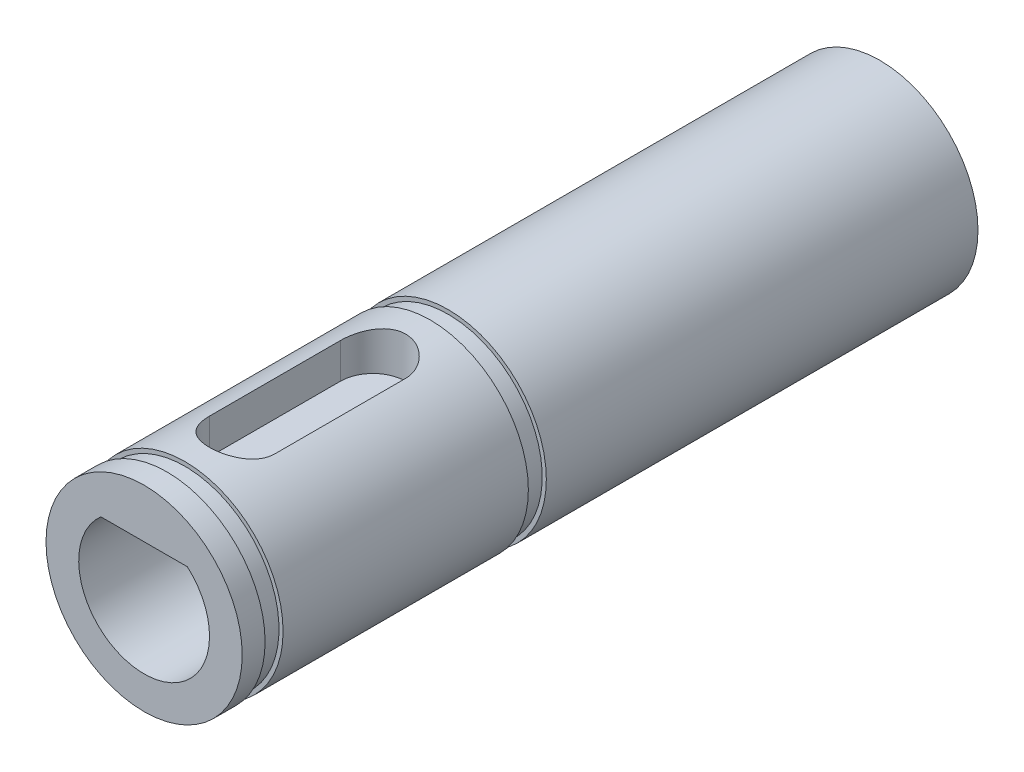
ISO-10303-21;
HEADER;
FILE_DESCRIPTION(('STEP AP214'),'2;1');
FILE_NAME('part.step','',(''),(''),'','','');
FILE_SCHEMA(('AUTOMOTIVE_DESIGN { 1 0 10303 214 1 1 1 1 }'));
ENDSEC;
DATA;
#1=APPLICATION_CONTEXT('core data for automotive mechanical design processes');
#2=APPLICATION_PROTOCOL_DEFINITION('international standard','automotive_design',2000,#1);
#3=PRODUCT_CONTEXT('',#1,'mechanical');
#4=PRODUCT('Part','Part','',(#3));
#5=PRODUCT_RELATED_PRODUCT_CATEGORY('part','',(#4));
#6=PRODUCT_DEFINITION_FORMATION('','',#4);
#7=PRODUCT_DEFINITION_CONTEXT('part definition',#1,'design');
#8=PRODUCT_DEFINITION('design','',#6,#7);
#9=PRODUCT_DEFINITION_SHAPE('','',#8);
#10=(LENGTH_UNIT() NAMED_UNIT(*) SI_UNIT(.MILLI.,.METRE.));
#11=(NAMED_UNIT(*) PLANE_ANGLE_UNIT() SI_UNIT($,.RADIAN.));
#12=(NAMED_UNIT(*) SI_UNIT($,.STERADIAN.) SOLID_ANGLE_UNIT());
#13=UNCERTAINTY_MEASURE_WITH_UNIT(LENGTH_MEASURE(1.E-05),#10,'distance_accuracy_value','');
#14=(GEOMETRIC_REPRESENTATION_CONTEXT(3) GLOBAL_UNCERTAINTY_ASSIGNED_CONTEXT((#13)) GLOBAL_UNIT_ASSIGNED_CONTEXT((#10,
#11,#12)) REPRESENTATION_CONTEXT('',''));
#15=CARTESIAN_POINT('',(0.,0.,0.));
#16=DIRECTION('',(0.,0.,1.));
#17=DIRECTION('',(1.,0.,0.));
#18=AXIS2_PLACEMENT_3D('',#15,#16,#17);
#19=CARTESIAN_POINT('',(0.,0.,45.));
#20=DIRECTION('',(0.,0.,-1.));
#21=DIRECTION('',(-1.,0.,0.));
#22=AXIS2_PLACEMENT_3D('',#19,#20,#21);
#23=CYLINDRICAL_SURFACE('',#22,6.);
#24=CARTESIAN_POINT('',(0.,0.,43.6));
#25=DIRECTION('',(0.,0.,-1.));
#26=DIRECTION('',(-1.,0.,0.));
#27=AXIS2_PLACEMENT_3D('',#24,#25,#26);
#28=CIRCLE('',#27,6.);
#29=CARTESIAN_POINT('',(-6.,0.,43.6));
#30=VERTEX_POINT('',#29);
#31=EDGE_CURVE('E219',#30,#30,#28,.T.);
#32=CARTESIAN_POINT('',(0.,0.,45.));
#33=DIRECTION('',(0.,0.,1.));
#34=DIRECTION('',(1.,0.,0.));
#35=AXIS2_PLACEMENT_3D('',#32,#33,#34);
#36=CIRCLE('',#35,6.);
#37=CARTESIAN_POINT('',(-6.,0.,45.));
#38=VERTEX_POINT('',#37);
#39=EDGE_CURVE('E146',#38,#38,#36,.T.);
#40=CARTESIAN_POINT('',(-6.,0.,43.6));
#41=CARTESIAN_POINT('',(-6.,0.,43.6145833333333));
#42=CARTESIAN_POINT('',(-6.,0.,43.6291666666667));
#43=CARTESIAN_POINT('',(-6.,0.,43.6583333333333));
#44=CARTESIAN_POINT('',(-6.,0.,43.6729166666667));
#45=CARTESIAN_POINT('',(-6.,0.,43.7020833333333));
#46=CARTESIAN_POINT('',(-6.,0.,43.7166666666667));
#47=CARTESIAN_POINT('',(-6.,0.,43.7458333333333));
#48=CARTESIAN_POINT('',(-6.,0.,43.7604166666667));
#49=CARTESIAN_POINT('',(-6.,0.,43.7895833333333));
#50=CARTESIAN_POINT('',(-6.,0.,43.8041666666667));
#51=CARTESIAN_POINT('',(-6.,0.,43.8333333333333));
#52=CARTESIAN_POINT('',(-6.,0.,43.8479166666667));
#53=CARTESIAN_POINT('',(-6.,0.,43.8770833333333));
#54=CARTESIAN_POINT('',(-6.,0.,43.8916666666667));
#55=CARTESIAN_POINT('',(-6.,0.,43.9208333333333));
#56=CARTESIAN_POINT('',(-6.,0.,43.9354166666667));
#57=CARTESIAN_POINT('',(-6.,0.,43.9645833333333));
#58=CARTESIAN_POINT('',(-6.,0.,43.9791666666667));
#59=CARTESIAN_POINT('',(-6.,0.,44.0083333333333));
#60=CARTESIAN_POINT('',(-6.,0.,44.0229166666667));
#61=CARTESIAN_POINT('',(-6.,0.,44.0520833333333));
#62=CARTESIAN_POINT('',(-6.,0.,44.0666666666667));
#63=CARTESIAN_POINT('',(-6.,0.,44.0958333333333));
#64=CARTESIAN_POINT('',(-6.,0.,44.1104166666667));
#65=CARTESIAN_POINT('',(-6.,0.,44.1395833333333));
#66=CARTESIAN_POINT('',(-6.,0.,44.1541666666667));
#67=CARTESIAN_POINT('',(-6.,0.,44.1833333333333));
#68=CARTESIAN_POINT('',(-6.,0.,44.1979166666667));
#69=CARTESIAN_POINT('',(-6.,0.,44.2270833333333));
#70=CARTESIAN_POINT('',(-6.,0.,44.2416666666667));
#71=CARTESIAN_POINT('',(-6.,0.,44.2708333333333));
#72=CARTESIAN_POINT('',(-6.,0.,44.2854166666667));
#73=CARTESIAN_POINT('',(-6.,0.,44.3145833333333));
#74=CARTESIAN_POINT('',(-6.,0.,44.3291666666667));
#75=CARTESIAN_POINT('',(-6.,0.,44.3583333333333));
#76=CARTESIAN_POINT('',(-6.,0.,44.3729166666667));
#77=CARTESIAN_POINT('',(-6.,0.,44.4020833333333));
#78=CARTESIAN_POINT('',(-6.,0.,44.4166666666667));
#79=CARTESIAN_POINT('',(-6.,0.,44.4458333333333));
#80=CARTESIAN_POINT('',(-6.,0.,44.4604166666667));
#81=CARTESIAN_POINT('',(-6.,0.,44.4895833333333));
#82=CARTESIAN_POINT('',(-6.,0.,44.5041666666667));
#83=CARTESIAN_POINT('',(-6.,0.,44.5333333333333));
#84=CARTESIAN_POINT('',(-6.,0.,44.5479166666667));
#85=CARTESIAN_POINT('',(-6.,0.,44.5770833333333));
#86=CARTESIAN_POINT('',(-6.,0.,44.5916666666667));
#87=CARTESIAN_POINT('',(-6.,0.,44.6208333333333));
#88=CARTESIAN_POINT('',(-6.,0.,44.6354166666667));
#89=CARTESIAN_POINT('',(-6.,0.,44.6645833333333));
#90=CARTESIAN_POINT('',(-6.,0.,44.6791666666667));
#91=CARTESIAN_POINT('',(-6.,0.,44.7083333333333));
#92=CARTESIAN_POINT('',(-6.,0.,44.7229166666667));
#93=CARTESIAN_POINT('',(-6.,0.,44.7520833333333));
#94=CARTESIAN_POINT('',(-6.,0.,44.7666666666667));
#95=CARTESIAN_POINT('',(-6.,0.,44.7958333333333));
#96=CARTESIAN_POINT('',(-6.,0.,44.8104166666667));
#97=CARTESIAN_POINT('',(-6.,0.,44.8395833333333));
#98=CARTESIAN_POINT('',(-6.,0.,44.8541666666667));
#99=CARTESIAN_POINT('',(-6.,0.,44.8833333333333));
#100=CARTESIAN_POINT('',(-6.,0.,44.8979166666667));
#101=CARTESIAN_POINT('',(-6.,0.,44.9270833333333));
#102=CARTESIAN_POINT('',(-6.,0.,44.9416666666667));
#103=CARTESIAN_POINT('',(-6.,0.,44.9708333333333));
#104=CARTESIAN_POINT('',(-6.,0.,44.9854166666667));
#105=CARTESIAN_POINT('',(-6.,0.,45.));
#106=B_SPLINE_CURVE_WITH_KNOTS('',3,(#40,#41,#42,#43,#44,#45,#46,#47,#48,#49,#50,#51,#52,#53,
#54,#55,#56,#57,#58,#59,#60,#61,#62,#63,#64,#65,#66,#67,#68,#69,#70,#71,#72,#73,#74,#75,#76,#77,
#78,#79,#80,#81,#82,#83,#84,#85,#86,#87,#88,#89,#90,#91,#92,#93,#94,#95,#96,#97,#98,#99,#100,
#101,#102,#103,#104,#105),.UNSPECIFIED.,.F.,.F.,(4,2,2,2,2,2,2,2,2,2,2,2,2,2,2,2,2,2,2,2,2,2,2,
2,2,2,2,2,2,2,2,2,4),(0.,0.0437499999999952,0.0874999999999973,0.131249999999992,
0.174999999999995,0.218749999999997,0.262499999999992,0.306249999999994,0.349999999999996,
0.393749999999991,0.437499999999993,0.481249999999996,0.524999999999991,0.568749999999993,
0.612499999999995,0.65624999999999,0.699999999999992,0.743749999999994,0.78749999999999,
0.831249999999992,0.874999999999994,0.918749999999989,0.962499999999991,1.00624999999999,
1.04999999999999,1.09374999999999,1.13749999999999,1.18124999999999,1.22499999999999,
1.26874999999999,1.31249999999999,1.35624999999999,1.39999999999999),.UNSPECIFIED.);
#107=EDGE_CURVE('BSEAM39',#30,#38,#106,.T.);
#108=ORIENTED_EDGE('',*,*,#31,.F.);
#109=ORIENTED_EDGE('',*,*,#39,.F.);
#110=ORIENTED_EDGE('',*,*,#107,.T.);
#111=ORIENTED_EDGE('',*,*,#107,.F.);
#112=EDGE_LOOP('',(#108,#110,#109,#111));
#113=FACE_BOUND('',#112,.T.);
#114=ADVANCED_FACE('F39',(#113),#23,.T.);
#115=CARTESIAN_POINT('',(0.,0.,45.));
#116=DIRECTION('',(0.,0.,1.));
#117=DIRECTION('',(1.,0.,0.));
#118=AXIS2_PLACEMENT_3D('',#115,#116,#117);
#119=PLANE('',#118);
#120=ORIENTED_EDGE('',*,*,#39,.T.);
#121=EDGE_LOOP('',(#120));
#122=FACE_BOUND('',#121,.T.);
#123=DIRECTION('',(-1.,0.,0.));
#124=VECTOR('',#123,1.);
#125=CARTESIAN_POINT('',(-2.64575131106459,3.,45.));
#126=LINE('',#125,#124);
#127=CARTESIAN_POINT('',(2.64575131106459,3.,45.));
#128=VERTEX_POINT('',#127);
#129=CARTESIAN_POINT('',(-2.64575131106459,3.,45.));
#130=VERTEX_POINT('',#129);
#131=EDGE_CURVE('E134',#128,#130,#126,.T.);
#132=ORIENTED_EDGE('',*,*,#131,.F.);
#133=CARTESIAN_POINT('',(0.,0.,45.));
#134=DIRECTION('',(0.,0.,1.));
#135=DIRECTION('',(1.,0.,0.));
#136=AXIS2_PLACEMENT_3D('',#133,#134,#135);
#137=CIRCLE('',#136,4.);
#138=EDGE_CURVE('E132',#130,#128,#137,.T.);
#139=ORIENTED_EDGE('',*,*,#138,.F.);
#140=EDGE_LOOP('',(#132,#139));
#141=FACE_BOUND('',#140,.T.);
#142=ADVANCED_FACE('F184',(#122,#141),#119,.T.);
#143=CARTESIAN_POINT('',(0.,0.,0.));
#144=DIRECTION('',(0.,0.,1.));
#145=DIRECTION('',(1.,0.,0.));
#146=AXIS2_PLACEMENT_3D('',#143,#144,#145);
#147=PLANE('',#146);
#148=CARTESIAN_POINT('',(0.,0.,0.));
#149=DIRECTION('',(0.,0.,1.));
#150=DIRECTION('',(1.,0.,0.));
#151=AXIS2_PLACEMENT_3D('',#148,#149,#150);
#152=CIRCLE('',#151,6.);
#153=CARTESIAN_POINT('',(-6.,0.,0.));
#154=VERTEX_POINT('',#153);
#155=EDGE_CURVE('E145',#154,#154,#152,.T.);
#156=ORIENTED_EDGE('',*,*,#155,.F.);
#157=EDGE_LOOP('',(#156));
#158=FACE_BOUND('',#157,.T.);
#159=CARTESIAN_POINT('',(0.,0.,0.));
#160=DIRECTION('',(0.,0.,1.));
#161=DIRECTION('',(1.,0.,0.));
#162=AXIS2_PLACEMENT_3D('',#159,#160,#161);
#163=CIRCLE('',#162,4.);
#164=CARTESIAN_POINT('',(-2.64575131106459,3.,0.));
#165=VERTEX_POINT('',#164);
#166=CARTESIAN_POINT('',(2.64575131106459,3.,0.));
#167=VERTEX_POINT('',#166);
#168=EDGE_CURVE('E127',#165,#167,#163,.T.);
#169=ORIENTED_EDGE('',*,*,#168,.T.);
#170=DIRECTION('',(-1.,0.,0.));
#171=VECTOR('',#170,1.);
#172=CARTESIAN_POINT('',(-2.64575131106459,3.,0.));
#173=LINE('',#172,#171);
#174=EDGE_CURVE('E135',#167,#165,#173,.T.);
#175=ORIENTED_EDGE('',*,*,#174,.T.);
#176=EDGE_LOOP('',(#169,#175));
#177=FACE_BOUND('',#176,.T.);
#178=ADVANCED_FACE('F186',(#158,#177),#147,.F.);
#179=CARTESIAN_POINT('',(0.,0.,26.4));
#180=DIRECTION('',(0.,0.,-1.));
#181=DIRECTION('',(-1.,0.,0.));
#182=AXIS2_PLACEMENT_3D('',#179,#180,#181);
#183=CIRCLE('',#182,6.);
#184=CARTESIAN_POINT('',(-6.,0.,26.4));
#185=VERTEX_POINT('',#184);
#186=EDGE_CURVE('E227',#185,#185,#183,.T.);
#187=CARTESIAN_POINT('',(-6.,0.,26.4));
#188=CARTESIAN_POINT('',(-6.,0.,26.125));
#189=CARTESIAN_POINT('',(-6.,0.,25.85));
#190=CARTESIAN_POINT('',(-6.,0.,25.3));
#191=CARTESIAN_POINT('',(-6.,0.,25.025));
#192=CARTESIAN_POINT('',(-6.,0.,24.475));
#193=CARTESIAN_POINT('',(-6.,0.,24.2));
#194=CARTESIAN_POINT('',(-6.,0.,23.65));
#195=CARTESIAN_POINT('',(-6.,0.,23.375));
#196=CARTESIAN_POINT('',(-6.,0.,22.825));
#197=CARTESIAN_POINT('',(-6.,0.,22.55));
#198=CARTESIAN_POINT('',(-6.,0.,22.));
#199=CARTESIAN_POINT('',(-6.,0.,21.725));
#200=CARTESIAN_POINT('',(-6.,0.,21.175));
#201=CARTESIAN_POINT('',(-6.,0.,20.9));
#202=CARTESIAN_POINT('',(-6.,0.,20.35));
#203=CARTESIAN_POINT('',(-6.,0.,20.075));
#204=CARTESIAN_POINT('',(-6.,0.,19.525));
#205=CARTESIAN_POINT('',(-6.,0.,19.25));
#206=CARTESIAN_POINT('',(-6.,0.,18.7));
#207=CARTESIAN_POINT('',(-6.,0.,18.425));
#208=CARTESIAN_POINT('',(-6.,0.,17.875));
#209=CARTESIAN_POINT('',(-6.,0.,17.6));
#210=CARTESIAN_POINT('',(-6.,0.,17.05));
#211=CARTESIAN_POINT('',(-6.,0.,16.775));
#212=CARTESIAN_POINT('',(-6.,0.,16.225));
#213=CARTESIAN_POINT('',(-6.,0.,15.95));
#214=CARTESIAN_POINT('',(-6.,0.,15.4));
#215=CARTESIAN_POINT('',(-6.,0.,15.125));
#216=CARTESIAN_POINT('',(-6.,0.,14.575));
#217=CARTESIAN_POINT('',(-6.,0.,14.3));
#218=CARTESIAN_POINT('',(-6.,0.,13.75));
#219=CARTESIAN_POINT('',(-6.,0.,13.475));
#220=CARTESIAN_POINT('',(-6.,0.,12.925));
#221=CARTESIAN_POINT('',(-6.,0.,12.65));
#222=CARTESIAN_POINT('',(-6.,0.,12.1));
#223=CARTESIAN_POINT('',(-6.,0.,11.825));
#224=CARTESIAN_POINT('',(-6.,0.,11.275));
#225=CARTESIAN_POINT('',(-6.,0.,11.));
#226=CARTESIAN_POINT('',(-6.,0.,10.45));
#227=CARTESIAN_POINT('',(-6.,0.,10.175));
#228=CARTESIAN_POINT('',(-6.,0.,9.625));
#229=CARTESIAN_POINT('',(-6.,0.,9.35));
#230=CARTESIAN_POINT('',(-6.,0.,8.8));
#231=CARTESIAN_POINT('',(-6.,0.,8.525));
#232=CARTESIAN_POINT('',(-6.,0.,7.975));
#233=CARTESIAN_POINT('',(-6.,0.,7.7));
#234=CARTESIAN_POINT('',(-6.,0.,7.14999999999999));
#235=CARTESIAN_POINT('',(-6.,0.,6.87499999999999));
#236=CARTESIAN_POINT('',(-6.,0.,6.32499999999999));
#237=CARTESIAN_POINT('',(-6.,0.,6.05));
#238=CARTESIAN_POINT('',(-6.,0.,5.5));
#239=CARTESIAN_POINT('',(-6.,0.,5.225));
#240=CARTESIAN_POINT('',(-6.,0.,4.675));
#241=CARTESIAN_POINT('',(-6.,0.,4.4));
#242=CARTESIAN_POINT('',(-6.,0.,3.84999999999999));
#243=CARTESIAN_POINT('',(-6.,0.,3.57499999999999));
#244=CARTESIAN_POINT('',(-6.,0.,3.02499999999999));
#245=CARTESIAN_POINT('',(-6.,0.,2.75));
#246=CARTESIAN_POINT('',(-6.,0.,2.2));
#247=CARTESIAN_POINT('',(-6.,0.,1.92499999999999));
#248=CARTESIAN_POINT('',(-6.,0.,1.37499999999999));
#249=CARTESIAN_POINT('',(-6.,0.,1.09999999999999));
#250=CARTESIAN_POINT('',(-6.,0.,0.549999999999993));
#251=CARTESIAN_POINT('',(-6.,0.,0.274999999999993));
#252=CARTESIAN_POINT('',(-6.,0.,0.));
#253=B_SPLINE_CURVE_WITH_KNOTS('',3,(#187,#188,#189,#190,#191,#192,#193,#194,#195,#196,#197,
#198,#199,#200,#201,#202,#203,#204,#205,#206,#207,#208,#209,#210,#211,#212,#213,#214,#215,#216,
#217,#218,#219,#220,#221,#222,#223,#224,#225,#226,#227,#228,#229,#230,#231,#232,#233,#234,#235,
#236,#237,#238,#239,#240,#241,#242,#243,#244,#245,#246,#247,#248,#249,#250,#251,#252),
.UNSPECIFIED.,.F.,.F.,(4,2,2,2,2,2,2,2,2,2,2,2,2,2,2,2,2,2,2,2,2,2,2,2,2,2,2,2,2,2,2,2,4),(0.,
0.824999999999999,1.65,2.475,3.3,4.125,4.95,5.775,6.6,7.425,8.25,9.07500000000001,
9.90000000000001,10.725,11.55,12.375,13.2,14.025,14.85,15.675,16.5,17.325,18.15,18.975,19.8,
20.625,21.45,22.275,23.1,23.925,24.75,25.575,26.4),.UNSPECIFIED.);
#254=EDGE_CURVE('BSEAM41',#185,#154,#253,.T.);
#255=ORIENTED_EDGE('',*,*,#186,.T.);
#256=ORIENTED_EDGE('',*,*,#155,.T.);
#257=ORIENTED_EDGE('',*,*,#254,.T.);
#258=ORIENTED_EDGE('',*,*,#254,.F.);
#259=EDGE_LOOP('',(#255,#257,#256,#258));
#260=FACE_BOUND('',#259,.T.);
#261=ADVANCED_FACE('F41',(#260),#23,.T.);
#262=CARTESIAN_POINT('',(0.,0.,45.));
#263=DIRECTION('',(0.,0.,-1.));
#264=DIRECTION('',(-1.,0.,0.));
#265=AXIS2_PLACEMENT_3D('',#262,#263,#264);
#266=CYLINDRICAL_SURFACE('',#265,4.);
#267=ORIENTED_EDGE('',*,*,#168,.F.);
#268=DIRECTION('',(0.,0.,-1.));
#269=VECTOR('',#268,1.);
#270=CARTESIAN_POINT('',(-2.64575131106459,3.,45.));
#271=LINE('',#270,#269);
#272=EDGE_CURVE('E137',#130,#165,#271,.T.);
#273=ORIENTED_EDGE('',*,*,#272,.F.);
#274=ORIENTED_EDGE('',*,*,#138,.T.);
#275=DIRECTION('',(0.,0.,-1.));
#276=VECTOR('',#275,1.);
#277=CARTESIAN_POINT('',(2.64575131106459,3.,45.));
#278=LINE('',#277,#276);
#279=EDGE_CURVE('E63',#128,#167,#278,.T.);
#280=ORIENTED_EDGE('',*,*,#279,.T.);
#281=EDGE_LOOP('',(#267,#273,#274,#280));
#282=FACE_BOUND('',#281,.T.);
#283=ADVANCED_FACE('F180',(#282),#266,.F.);
#284=CARTESIAN_POINT('',(-2.64575131106459,3.,45.));
#285=DIRECTION('',(0.,-1.,0.));
#286=DIRECTION('',(0.,0.,-1.));
#287=AXIS2_PLACEMENT_3D('',#284,#285,#286);
#288=PLANE('',#287);
#289=ORIENTED_EDGE('',*,*,#174,.F.);
#290=ORIENTED_EDGE('',*,*,#279,.F.);
#291=ORIENTED_EDGE('',*,*,#131,.T.);
#292=ORIENTED_EDGE('',*,*,#272,.T.);
#293=EDGE_LOOP('',(#289,#290,#291,#292));
#294=FACE_BOUND('',#293,.T.);
#295=ADVANCED_FACE('F176',(#294),#288,.T.);
#296=CARTESIAN_POINT('',(0.,6.,43.6));
#297=DIRECTION('',(0.,0.,1.));
#298=DIRECTION('',(1.,0.,0.));
#299=AXIS2_PLACEMENT_3D('',#296,#297,#298);
#300=PLANE('',#299);
#301=CARTESIAN_POINT('',(0.,0.,43.6));
#302=DIRECTION('',(0.,0.,-1.));
#303=DIRECTION('',(-1.,0.,0.));
#304=AXIS2_PLACEMENT_3D('',#301,#302,#303);
#305=CIRCLE('',#304,5.75);
#306=CARTESIAN_POINT('',(-5.75,0.,43.6));
#307=VERTEX_POINT('',#306);
#308=EDGE_CURVE('E120',#307,#307,#305,.T.);
#309=ORIENTED_EDGE('',*,*,#308,.F.);
#310=EDGE_LOOP('',(#309));
#311=FACE_BOUND('',#310,.T.);
#312=ORIENTED_EDGE('',*,*,#31,.T.);
#313=EDGE_LOOP('',(#312));
#314=FACE_BOUND('',#313,.T.);
#315=ADVANCED_FACE('F179',(#311,#314),#300,.F.);
#316=CARTESIAN_POINT('',(0.,0.,0.));
#317=DIRECTION('',(0.,0.,-1.));
#318=DIRECTION('',(-1.,0.,0.));
#319=AXIS2_PLACEMENT_3D('',#316,#317,#318);
#320=CYLINDRICAL_SURFACE('',#319,5.75);
#321=CARTESIAN_POINT('',(0.,0.,42.5));
#322=DIRECTION('',(0.,0.,-1.));
#323=DIRECTION('',(-1.,0.,0.));
#324=AXIS2_PLACEMENT_3D('',#321,#322,#323);
#325=CIRCLE('',#324,5.75);
#326=CARTESIAN_POINT('',(-5.75,0.,42.5));
#327=VERTEX_POINT('',#326);
#328=EDGE_CURVE('E218',#327,#327,#325,.T.);
#329=ORIENTED_EDGE('',*,*,#328,.F.);
#330=EDGE_LOOP('',(#329));
#331=FACE_BOUND('',#330,.T.);
#332=ORIENTED_EDGE('',*,*,#308,.T.);
#333=EDGE_LOOP('',(#332));
#334=FACE_BOUND('',#333,.T.);
#335=ADVANCED_FACE('F234',(#331,#334),#320,.T.);
#336=CARTESIAN_POINT('',(0.,6.,42.5));
#337=DIRECTION('',(0.,0.,-1.));
#338=DIRECTION('',(-1.,0.,0.));
#339=AXIS2_PLACEMENT_3D('',#336,#337,#338);
#340=PLANE('',#339);
#341=CARTESIAN_POINT('',(0.,0.,42.5));
#342=DIRECTION('',(0.,0.,-1.));
#343=DIRECTION('',(-1.,0.,0.));
#344=AXIS2_PLACEMENT_3D('',#341,#342,#343);
#345=CIRCLE('',#344,6.);
#346=CARTESIAN_POINT('',(-6.,0.,42.5));
#347=VERTEX_POINT('',#346);
#348=EDGE_CURVE('E216',#347,#347,#345,.T.);
#349=ORIENTED_EDGE('',*,*,#348,.F.);
#350=EDGE_LOOP('',(#349));
#351=FACE_BOUND('',#350,.T.);
#352=ORIENTED_EDGE('',*,*,#328,.T.);
#353=EDGE_LOOP('',(#352));
#354=FACE_BOUND('',#353,.T.);
#355=ADVANCED_FACE('F242',(#351,#354),#340,.F.);
#356=CARTESIAN_POINT('',(0.,6.,27.5));
#357=DIRECTION('',(0.,0.,1.));
#358=DIRECTION('',(1.,0.,0.));
#359=AXIS2_PLACEMENT_3D('',#356,#357,#358);
#360=PLANE('',#359);
#361=CARTESIAN_POINT('',(0.,0.,27.5));
#362=DIRECTION('',(0.,0.,-1.));
#363=DIRECTION('',(-1.,0.,0.));
#364=AXIS2_PLACEMENT_3D('',#361,#362,#363);
#365=CIRCLE('',#364,5.75);
#366=CARTESIAN_POINT('',(-5.75,0.,27.5));
#367=VERTEX_POINT('',#366);
#368=EDGE_CURVE('E114',#367,#367,#365,.T.);
#369=ORIENTED_EDGE('',*,*,#368,.F.);
#370=EDGE_LOOP('',(#369));
#371=FACE_BOUND('',#370,.T.);
#372=CARTESIAN_POINT('',(0.,0.,27.5));
#373=DIRECTION('',(0.,0.,-1.));
#374=DIRECTION('',(-1.,0.,0.));
#375=AXIS2_PLACEMENT_3D('',#372,#373,#374);
#376=CIRCLE('',#375,6.);
#377=CARTESIAN_POINT('',(-6.,0.,27.5));
#378=VERTEX_POINT('',#377);
#379=EDGE_CURVE('E212',#378,#378,#376,.T.);
#380=ORIENTED_EDGE('',*,*,#379,.T.);
#381=EDGE_LOOP('',(#380));
#382=FACE_BOUND('',#381,.T.);
#383=ADVANCED_FACE('F257',(#371,#382),#360,.F.);
#384=CARTESIAN_POINT('',(0.,0.,0.));
#385=DIRECTION('',(0.,0.,-1.));
#386=DIRECTION('',(-1.,0.,0.));
#387=AXIS2_PLACEMENT_3D('',#384,#385,#386);
#388=CYLINDRICAL_SURFACE('',#387,5.75);
#389=CARTESIAN_POINT('',(0.,0.,26.4));
#390=DIRECTION('',(0.,0.,-1.));
#391=DIRECTION('',(-1.,0.,0.));
#392=AXIS2_PLACEMENT_3D('',#389,#390,#391);
#393=CIRCLE('',#392,5.75);
#394=CARTESIAN_POINT('',(-5.75,0.,26.4));
#395=VERTEX_POINT('',#394);
#396=EDGE_CURVE('E117',#395,#395,#393,.T.);
#397=ORIENTED_EDGE('',*,*,#396,.F.);
#398=EDGE_LOOP('',(#397));
#399=FACE_BOUND('',#398,.T.);
#400=ORIENTED_EDGE('',*,*,#368,.T.);
#401=EDGE_LOOP('',(#400));
#402=FACE_BOUND('',#401,.T.);
#403=ADVANCED_FACE('F251',(#399,#402),#388,.T.);
#404=CARTESIAN_POINT('',(0.,6.,26.4));
#405=DIRECTION('',(0.,0.,-1.));
#406=DIRECTION('',(-1.,0.,0.));
#407=AXIS2_PLACEMENT_3D('',#404,#405,#406);
#408=PLANE('',#407);
#409=ORIENTED_EDGE('',*,*,#186,.F.);
#410=EDGE_LOOP('',(#409));
#411=FACE_BOUND('',#410,.T.);
#412=ORIENTED_EDGE('',*,*,#396,.T.);
#413=EDGE_LOOP('',(#412));
#414=FACE_BOUND('',#413,.T.);
#415=ADVANCED_FACE('F247',(#411,#414),#408,.F.);
#416=CARTESIAN_POINT('',(0.,3.5,39.));
#417=DIRECTION('',(0.,1.,0.));
#418=DIRECTION('',(0.,0.,1.));
#419=AXIS2_PLACEMENT_3D('',#416,#417,#418);
#420=PLANE('',#419);
#421=CARTESIAN_POINT('',(0.,3.5,39.));
#422=DIRECTION('',(0.,1.,0.));
#423=DIRECTION('',(0.,0.,1.));
#424=AXIS2_PLACEMENT_3D('',#421,#422,#423);
#425=CIRCLE('',#424,2.);
#426=CARTESIAN_POINT('',(-2.,3.5,39.));
#427=VERTEX_POINT('',#426);
#428=CARTESIAN_POINT('',(2.,3.5,39.));
#429=VERTEX_POINT('',#428);
#430=EDGE_CURVE('E96',#427,#429,#425,.T.);
#431=ORIENTED_EDGE('',*,*,#430,.T.);
#432=DIRECTION('',(0.,0.,-1.));
#433=VECTOR('',#432,1.);
#434=CARTESIAN_POINT('',(2.,3.5,39.));
#435=LINE('',#434,#433);
#436=CARTESIAN_POINT('',(2.,3.5,31.));
#437=VERTEX_POINT('',#436);
#438=EDGE_CURVE('E104',#429,#437,#435,.T.);
#439=ORIENTED_EDGE('',*,*,#438,.T.);
#440=CARTESIAN_POINT('',(0.,3.5,31.));
#441=DIRECTION('',(0.,1.,0.));
#442=DIRECTION('',(0.,0.,1.));
#443=AXIS2_PLACEMENT_3D('',#440,#441,#442);
#444=CIRCLE('',#443,2.);
#445=CARTESIAN_POINT('',(-2.,3.5,31.));
#446=VERTEX_POINT('',#445);
#447=EDGE_CURVE('E110',#437,#446,#444,.T.);
#448=ORIENTED_EDGE('',*,*,#447,.T.);
#449=DIRECTION('',(0.,0.,1.));
#450=VECTOR('',#449,1.);
#451=CARTESIAN_POINT('',(-2.,3.5,39.));
#452=LINE('',#451,#450);
#453=EDGE_CURVE('E101',#446,#427,#452,.T.);
#454=ORIENTED_EDGE('',*,*,#453,.T.);
#455=EDGE_LOOP('',(#431,#439,#448,#454));
#456=FACE_BOUND('',#455,.T.);
#457=ADVANCED_FACE('F112',(#456),#420,.T.);
#458=CARTESIAN_POINT('',(0.,3.5,39.));
#459=DIRECTION('',(0.,1.,0.));
#460=DIRECTION('',(0.,0.,1.));
#461=AXIS2_PLACEMENT_3D('',#458,#459,#460);
#462=CYLINDRICAL_SURFACE('',#461,2.);
#463=DIRECTION('',(0.,1.,0.));
#464=VECTOR('',#463,1.);
#465=CARTESIAN_POINT('',(2.,3.5,39.));
#466=LINE('',#465,#464);
#467=CARTESIAN_POINT('',(2.,5.65685424949238,39.));
#468=VERTEX_POINT('',#467);
#469=EDGE_CURVE('E92',#429,#468,#466,.T.);
#470=ORIENTED_EDGE('',*,*,#469,.F.);
#471=ORIENTED_EDGE('',*,*,#430,.F.);
#472=DIRECTION('',(0.,1.,0.));
#473=VECTOR('',#472,1.);
#474=CARTESIAN_POINT('',(-2.,3.5,39.));
#475=LINE('',#474,#473);
#476=CARTESIAN_POINT('',(-2.,5.65685424949238,39.));
#477=VERTEX_POINT('',#476);
#478=EDGE_CURVE('E125',#427,#477,#475,.T.);
#479=ORIENTED_EDGE('',*,*,#478,.T.);
#480=CARTESIAN_POINT('',(2.,5.65685424949238,39.));
#481=CARTESIAN_POINT('',(2.0000014949184,5.65684884188678,39.0545809936022));
#482=CARTESIAN_POINT('',(1.99776424917479,5.6576451988649,39.1091341243786));
#483=CARTESIAN_POINT('',(1.98885121407281,5.66078654578442,39.2178171681098));
#484=CARTESIAN_POINT('',(1.98217662286705,5.66313111768244,39.2719471913194));
#485=CARTESIAN_POINT('',(1.95562135046158,5.67238184449301,39.4327842863903));
#486=CARTESIAN_POINT('',(1.92920846605623,5.6815058499903,39.538361692541));
#487=CARTESIAN_POINT('',(1.85991682366086,5.70456149397718,39.7432503848876));
#488=CARTESIAN_POINT('',(1.81704715197507,5.71849047905858,39.8425650937458));
#489=CARTESIAN_POINT('',(1.71614645792974,5.74957574438921,40.0326796680109));
#490=CARTESIAN_POINT('',(1.65810612564547,5.76673400456216,40.1234742581347));
#491=CARTESIAN_POINT('',(1.52610278704603,5.80308960804095,40.2974404626491));
#492=CARTESIAN_POINT('',(1.45164996064407,5.82233755536618,40.3802297609252));
#493=CARTESIAN_POINT('',(1.28997688598297,5.86027697385956,40.5324120355834));
#494=CARTESIAN_POINT('',(1.20275436910907,5.87896834543706,40.6018026265119));
#495=CARTESIAN_POINT('',(1.01520729191253,5.91427765988454,40.7269590376084));
#496=CARTESIAN_POINT('',(0.914600178716991,5.93082875123708,40.7823219688045));
#497=CARTESIAN_POINT('',(0.704858499931716,5.95939217209317,40.8751845033745));
#498=CARTESIAN_POINT('',(0.595726551186837,5.97140588786619,40.9126895636409));
#499=CARTESIAN_POINT('',(0.37605869095607,5.98918142285845,40.9674714521827));
#500=CARTESIAN_POINT('',(0.26570366892022,5.99514617977147,40.9854065451074));
#501=CARTESIAN_POINT('',(0.0433979389113416,6.00087216807634,41.0026325970512));
#502=CARTESIAN_POINT('',(-0.0685523824907893,6.00063487762605,41.0019279985395));
#503=CARTESIAN_POINT('',(-0.286207690558789,5.99412077270532,40.9823114337867));
#504=CARTESIAN_POINT('',(-0.391985405251077,5.98808121982527,40.9641147240811));
#505=CARTESIAN_POINT('',(-0.598888128753317,5.97093921001647,40.9112136026518));
#506=CARTESIAN_POINT('',(-0.700012879232933,5.95983647235462,40.8765082755875));
#507=CARTESIAN_POINT('',(-0.896305246061929,5.93351336542608,40.7911572607987));
#508=CARTESIAN_POINT('',(-0.991377011307988,5.91824075676625,40.7403079097553));
#509=CARTESIAN_POINT('',(-1.17184917819498,5.88516775360088,40.6242800972186));
#510=CARTESIAN_POINT('',(-1.25724693942937,5.86736667195186,40.559097737907));
#511=CARTESIAN_POINT('',(-1.42019467942243,5.83012543885479,40.4126579000063));
#512=CARTESIAN_POINT('',(-1.4971872232254,5.81064757359828,40.3307889127806));
#513=CARTESIAN_POINT('',(-1.63654404964077,5.77294980945702,40.1551170205677));
#514=CARTESIAN_POINT('',(-1.69890360636763,5.75473031831506,40.0613102751935));
#515=CARTESIAN_POINT('',(-1.80800665118557,5.72140062752635,39.8626396432934));
#516=CARTESIAN_POINT('',(-1.85450601901537,5.70634029896469,39.7576329701341));
#517=CARTESIAN_POINT('',(-1.92892046140224,5.68162194124078,39.5407060448201));
#518=CARTESIAN_POINT('',(-1.95686487211072,5.67195538817986,39.4287970132557));
#519=CARTESIAN_POINT('',(-1.98331631256166,5.6627308418944,39.263162726504));
#520=CARTESIAN_POINT('',(-1.98957012251023,5.66053335389204,39.2107172202915));
#521=CARTESIAN_POINT('',(-1.9979092321424,5.65759407142798,39.1055238432004));
#522=CARTESIAN_POINT('',(-1.99999991078996,5.65685039859056,39.0527764509112));
#523=CARTESIAN_POINT('',(-2.,5.65685424949238,39.));
#524=B_SPLINE_CURVE_WITH_KNOTS('',3,(#480,#481,#482,#483,#484,#485,#486,#487,#488,#489,#490,
#491,#492,#493,#494,#495,#496,#497,#498,#499,#500,#501,#502,#503,#504,#505,#506,#507,#508,#509,
#510,#511,#512,#513,#514,#515,#516,#517,#518,#519,#520,#521,#522,#523),.UNSPECIFIED.,.F.,.F.,(4,
2,2,2,2,2,2,2,2,2,2,2,2,2,2,2,2,2,2,2,2,4),(0.,0.16363696947086,0.327229772338919,
0.653162396790749,0.978915321932473,1.30486862627062,1.64233009925355,1.97985159727495,
2.32618265866203,2.67240782242255,3.00658941454806,3.34069136061285,3.66168836931471,
3.98270317816496,4.30794037651936,4.63326613177538,4.97388108116101,5.31460588498485,
5.6603605985608,6.0055673497368,6.16399790665504,6.32222363058114),.UNSPECIFIED.);
#525=EDGE_CURVE('E55',#468,#477,#524,.T.);
#526=ORIENTED_EDGE('',*,*,#525,.F.);
#527=EDGE_LOOP('',(#470,#471,#479,#526));
#528=FACE_BOUND('',#527,.T.);
#529=ADVANCED_FACE('F94',(#528),#462,.F.);
#530=CARTESIAN_POINT('',(2.,3.5,39.));
#531=DIRECTION('',(1.,0.,0.));
#532=DIRECTION('',(0.,0.,-1.));
#533=AXIS2_PLACEMENT_3D('',#530,#531,#532);
#534=PLANE('',#533);
#535=DIRECTION('',(0.,1.,0.));
#536=VECTOR('',#535,1.);
#537=CARTESIAN_POINT('',(2.,3.5,31.));
#538=LINE('',#537,#536);
#539=CARTESIAN_POINT('',(2.,5.65685424949238,31.));
#540=VERTEX_POINT('',#539);
#541=EDGE_CURVE('E100',#437,#540,#538,.T.);
#542=ORIENTED_EDGE('',*,*,#541,.F.);
#543=ORIENTED_EDGE('',*,*,#438,.F.);
#544=ORIENTED_EDGE('',*,*,#469,.T.);
#545=DIRECTION('',(0.,0.,-1.));
#546=VECTOR('',#545,1.);
#547=CARTESIAN_POINT('',(2.,5.65685424949238,45.));
#548=LINE('',#547,#546);
#549=EDGE_CURVE('E48',#540,#468,#548,.F.);
#550=ORIENTED_EDGE('',*,*,#549,.F.);
#551=EDGE_LOOP('',(#542,#543,#544,#550));
#552=FACE_BOUND('',#551,.T.);
#553=ADVANCED_FACE('F105',(#552),#534,.F.);
#554=CARTESIAN_POINT('',(0.,3.5,31.));
#555=DIRECTION('',(0.,1.,0.));
#556=DIRECTION('',(0.,0.,1.));
#557=AXIS2_PLACEMENT_3D('',#554,#555,#556);
#558=CYLINDRICAL_SURFACE('',#557,2.);
#559=DIRECTION('',(0.,1.,0.));
#560=VECTOR('',#559,1.);
#561=CARTESIAN_POINT('',(-2.,3.5,31.));
#562=LINE('',#561,#560);
#563=CARTESIAN_POINT('',(-2.,5.65685424949238,31.));
#564=VERTEX_POINT('',#563);
#565=EDGE_CURVE('E128',#446,#564,#562,.T.);
#566=ORIENTED_EDGE('',*,*,#565,.F.);
#567=ORIENTED_EDGE('',*,*,#447,.F.);
#568=ORIENTED_EDGE('',*,*,#541,.T.);
#569=CARTESIAN_POINT('',(-2.,5.65685424949238,31.));
#570=CARTESIAN_POINT('',(-2.0000014949184,5.65684884188678,30.9454190063978));
#571=CARTESIAN_POINT('',(-1.99776424917479,5.6576451988649,30.8908658756213));
#572=CARTESIAN_POINT('',(-1.98885121407281,5.66078654578442,30.7821828318902));
#573=CARTESIAN_POINT('',(-1.98217662286705,5.66313111768244,30.7280528086806));
#574=CARTESIAN_POINT('',(-1.95562135046158,5.67238184449301,30.5672157136097));
#575=CARTESIAN_POINT('',(-1.92920846605623,5.6815058499903,30.461638307459));
#576=CARTESIAN_POINT('',(-1.85991682366086,5.70456149397718,30.2567496151124));
#577=CARTESIAN_POINT('',(-1.81704715197507,5.71849047905858,30.1574349062542));
#578=CARTESIAN_POINT('',(-1.71614645792974,5.74957574438921,29.9673203319891));
#579=CARTESIAN_POINT('',(-1.65810612564548,5.76673400456216,29.8765257418653));
#580=CARTESIAN_POINT('',(-1.52610278704603,5.80308960804095,29.7025595373509));
#581=CARTESIAN_POINT('',(-1.45164996064408,5.82233755536618,29.6197702390748));
#582=CARTESIAN_POINT('',(-1.28997688598297,5.86027697385956,29.4675879644166));
#583=CARTESIAN_POINT('',(-1.20275436910908,5.87896834543705,29.3981973734881));
#584=CARTESIAN_POINT('',(-1.01520729191253,5.91427765988454,29.2730409623916));
#585=CARTESIAN_POINT('',(-0.914600178716998,5.93082875123708,29.2176780311955));
#586=CARTESIAN_POINT('',(-0.704858499931723,5.95939217209317,29.1248154966255));
#587=CARTESIAN_POINT('',(-0.595726551186845,5.97140588786619,29.0873104363591));
#588=CARTESIAN_POINT('',(-0.376058690956078,5.98918142285845,29.0325285478172));
#589=CARTESIAN_POINT('',(-0.265703668920228,5.99514617977147,29.0145934548926));
#590=CARTESIAN_POINT('',(-0.0433979389113496,6.00087216807634,28.9973674029488));
#591=CARTESIAN_POINT('',(0.0685523824907816,6.00063487762605,28.9980720014605));
#592=CARTESIAN_POINT('',(0.286207690558782,5.99412077270532,29.0176885662133));
#593=CARTESIAN_POINT('',(0.39198540525107,5.98808121982528,29.0358852759189));
#594=CARTESIAN_POINT('',(0.59888812875331,5.97093921001647,29.0887863973482));
#595=CARTESIAN_POINT('',(0.700012879232926,5.95983647235462,29.1234917244125));
#596=CARTESIAN_POINT('',(0.896305246061923,5.93351336542608,29.2088427392013));
#597=CARTESIAN_POINT('',(0.991377011307983,5.91824075676625,29.2596920902447));
#598=CARTESIAN_POINT('',(1.17184917819498,5.88516775360088,29.3757199027814));
#599=CARTESIAN_POINT('',(1.25724693942937,5.86736667195186,29.440902262093));
#600=CARTESIAN_POINT('',(1.42019467942242,5.83012543885479,29.5873420999937));
#601=CARTESIAN_POINT('',(1.4971872232254,5.81064757359828,29.6692110872194));
#602=CARTESIAN_POINT('',(1.63654404964077,5.77294980945702,29.8448829794323));
#603=CARTESIAN_POINT('',(1.69890360636763,5.75473031831506,29.9386897248065));
#604=CARTESIAN_POINT('',(1.80800665118557,5.72140062752635,30.1373603567066));
#605=CARTESIAN_POINT('',(1.85450601901537,5.70634029896469,30.2423670298659));
#606=CARTESIAN_POINT('',(1.92892046140223,5.68162194124078,30.4592939551799));
#607=CARTESIAN_POINT('',(1.95686487211071,5.67195538817986,30.5712029867443));
#608=CARTESIAN_POINT('',(1.98331631256166,5.6627308418944,30.736837273496));
#609=CARTESIAN_POINT('',(1.98957012251023,5.66053335389204,30.7892827797084));
#610=CARTESIAN_POINT('',(1.9979092321424,5.65759407142798,30.8944761567996));
#611=CARTESIAN_POINT('',(1.99999991078996,5.65685039859056,30.9472235490888));
#612=CARTESIAN_POINT('',(2.,5.65685424949238,31.));
#613=B_SPLINE_CURVE_WITH_KNOTS('',3,(#569,#570,#571,#572,#573,#574,#575,#576,#577,#578,#579,
#580,#581,#582,#583,#584,#585,#586,#587,#588,#589,#590,#591,#592,#593,#594,#595,#596,#597,#598,
#599,#600,#601,#602,#603,#604,#605,#606,#607,#608,#609,#610,#611,#612),.UNSPECIFIED.,.F.,.F.,(4,
2,2,2,2,2,2,2,2,2,2,2,2,2,2,2,2,2,2,2,2,4),(0.,0.163636969470864,0.327229772338922,
0.653162396790745,0.978915321932474,1.30486862627062,1.64233009925354,1.97985159727495,
2.32618265866203,2.67240782242255,3.00658941454806,3.34069136061285,3.66168836931471,
3.98270317816496,4.30794037651936,4.63326613177537,4.97388108116101,5.31460588498485,
5.6603605985608,6.00556734973679,6.16399790665503,6.32222363058114),.UNSPECIFIED.);
#614=EDGE_CURVE('E149',#564,#540,#613,.T.);
#615=ORIENTED_EDGE('',*,*,#614,.F.);
#616=EDGE_LOOP('',(#566,#567,#568,#615));
#617=FACE_BOUND('',#616,.T.);
#618=ADVANCED_FACE('F164',(#617),#558,.F.);
#619=CARTESIAN_POINT('',(-2.,3.5,39.));
#620=DIRECTION('',(-1.,0.,0.));
#621=DIRECTION('',(0.,0.,1.));
#622=AXIS2_PLACEMENT_3D('',#619,#620,#621);
#623=PLANE('',#622);
#624=ORIENTED_EDGE('',*,*,#478,.F.);
#625=ORIENTED_EDGE('',*,*,#453,.F.);
#626=ORIENTED_EDGE('',*,*,#565,.T.);
#627=DIRECTION('',(0.,0.,-1.));
#628=VECTOR('',#627,1.);
#629=CARTESIAN_POINT('',(-2.00000000000001,5.65685424949238,45.));
#630=LINE('',#629,#628);
#631=EDGE_CURVE('E11',#477,#564,#630,.T.);
#632=ORIENTED_EDGE('',*,*,#631,.F.);
#633=EDGE_LOOP('',(#624,#625,#626,#632));
#634=FACE_BOUND('',#633,.T.);
#635=ADVANCED_FACE('F169',(#634),#623,.F.);
#636=ORIENTED_EDGE('',*,*,#379,.F.);
#637=EDGE_LOOP('',(#636));
#638=FACE_BOUND('',#637,.T.);
#639=ORIENTED_EDGE('',*,*,#631,.T.);
#640=ORIENTED_EDGE('',*,*,#614,.T.);
#641=ORIENTED_EDGE('',*,*,#549,.T.);
#642=ORIENTED_EDGE('',*,*,#525,.T.);
#643=EDGE_LOOP('',(#639,#640,#641,#642));
#644=FACE_BOUND('',#643,.T.);
#645=ORIENTED_EDGE('',*,*,#348,.T.);
#646=EDGE_LOOP('',(#645));
#647=FACE_BOUND('',#646,.T.);
#648=ADVANCED_FACE('F194',(#638,#644,#647),#23,.T.);
#649=CLOSED_SHELL('',(#114,#142,#178,#261,#283,#295,#315,#335,#355,#383,#403,#415,#457,#529,
#553,#618,#635,#648));
#650=MANIFOLD_SOLID_BREP('B2',#649);
#651=ADVANCED_BREP_SHAPE_REPRESENTATION('',(#18,#650),#14);
#652=SHAPE_DEFINITION_REPRESENTATION(#9,#651);
ENDSEC;
END-ISO-10303-21;
